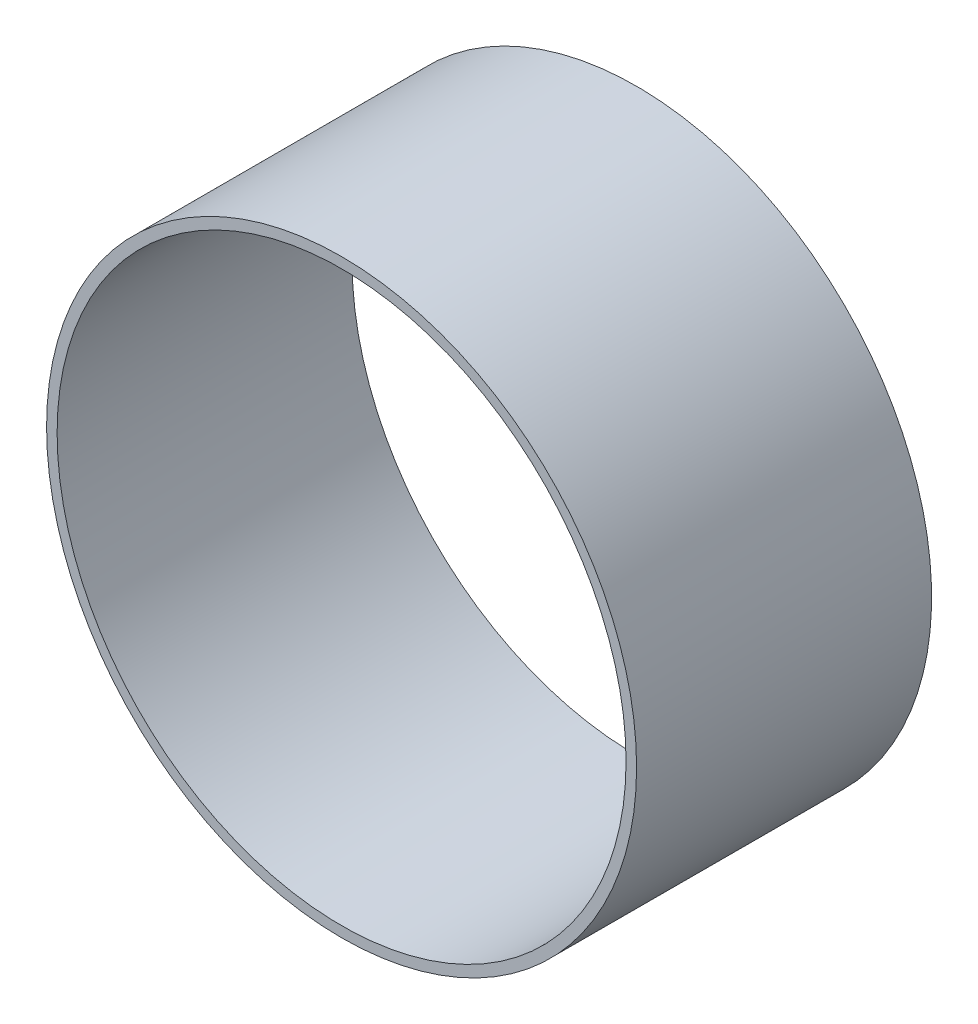
ISO-10303-21;
HEADER;
FILE_DESCRIPTION(('STEP AP214'),'2;1');
FILE_NAME('part.step','',(''),(''),'','','');
FILE_SCHEMA(('AUTOMOTIVE_DESIGN { 1 0 10303 214 1 1 1 1 }'));
ENDSEC;
DATA;
#1=APPLICATION_CONTEXT('core data for automotive mechanical design processes');
#2=APPLICATION_PROTOCOL_DEFINITION('international standard','automotive_design',2000,#1);
#3=PRODUCT_CONTEXT('',#1,'mechanical');
#4=PRODUCT('Part','Part','',(#3));
#5=PRODUCT_RELATED_PRODUCT_CATEGORY('part','',(#4));
#6=PRODUCT_DEFINITION_FORMATION('','',#4);
#7=PRODUCT_DEFINITION_CONTEXT('part definition',#1,'design');
#8=PRODUCT_DEFINITION('design','',#6,#7);
#9=PRODUCT_DEFINITION_SHAPE('','',#8);
#10=(LENGTH_UNIT() NAMED_UNIT(*) SI_UNIT(.MILLI.,.METRE.));
#11=(NAMED_UNIT(*) PLANE_ANGLE_UNIT() SI_UNIT($,.RADIAN.));
#12=(NAMED_UNIT(*) SI_UNIT($,.STERADIAN.) SOLID_ANGLE_UNIT());
#13=UNCERTAINTY_MEASURE_WITH_UNIT(LENGTH_MEASURE(1.E-05),#10,'distance_accuracy_value','');
#14=(GEOMETRIC_REPRESENTATION_CONTEXT(3) GLOBAL_UNCERTAINTY_ASSIGNED_CONTEXT((#13)) GLOBAL_UNIT_ASSIGNED_CONTEXT((#10,
#11,#12)) REPRESENTATION_CONTEXT('',''));
#15=CARTESIAN_POINT('',(0.,0.,0.));
#16=DIRECTION('',(0.,0.,1.));
#17=DIRECTION('',(1.,0.,0.));
#18=AXIS2_PLACEMENT_3D('',#15,#16,#17);
#19=CARTESIAN_POINT('',(0.,0.,19.));
#20=DIRECTION('',(0.,0.,-1.));
#21=DIRECTION('',(-1.,0.,0.));
#22=AXIS2_PLACEMENT_3D('',#19,#20,#21);
#23=CYLINDRICAL_SURFACE('',#22,14.);
#24=CARTESIAN_POINT('',(0.,0.,19.));
#25=DIRECTION('',(0.,0.,1.));
#26=DIRECTION('',(1.,0.,0.));
#27=AXIS2_PLACEMENT_3D('',#24,#25,#26);
#28=CIRCLE('',#27,14.);
#29=CARTESIAN_POINT('',(14.,0.,19.));
#30=VERTEX_POINT('',#29);
#31=EDGE_CURVE('E10',#30,#30,#28,.T.);
#32=ORIENTED_EDGE('',*,*,#31,.F.);
#33=EDGE_LOOP('',(#32));
#34=FACE_BOUND('',#33,.T.);
#35=CARTESIAN_POINT('',(0.,0.,5.));
#36=DIRECTION('',(0.,0.,-1.));
#37=DIRECTION('',(-1.,0.,0.));
#38=AXIS2_PLACEMENT_3D('',#35,#36,#37);
#39=CIRCLE('',#38,14.);
#40=CARTESIAN_POINT('',(-14.,0.,5.));
#41=VERTEX_POINT('',#40);
#42=EDGE_CURVE('E43',#41,#41,#39,.T.);
#43=ORIENTED_EDGE('',*,*,#42,.F.);
#44=EDGE_LOOP('',(#43));
#45=FACE_BOUND('',#44,.T.);
#46=ADVANCED_FACE('F32',(#34,#45),#23,.T.);
#47=CARTESIAN_POINT('',(0.,0.,19.));
#48=DIRECTION('',(0.,0.,-1.));
#49=DIRECTION('',(-1.,0.,0.));
#50=AXIS2_PLACEMENT_3D('',#47,#48,#49);
#51=CYLINDRICAL_SURFACE('',#50,13.5);
#52=CARTESIAN_POINT('',(0.,0.,19.));
#53=DIRECTION('',(0.,0.,1.));
#54=DIRECTION('',(1.,0.,0.));
#55=AXIS2_PLACEMENT_3D('',#52,#53,#54);
#56=CIRCLE('',#55,13.5);
#57=CARTESIAN_POINT('',(13.5,0.,19.));
#58=VERTEX_POINT('',#57);
#59=EDGE_CURVE('E39',#58,#58,#56,.T.);
#60=ORIENTED_EDGE('',*,*,#59,.T.);
#61=EDGE_LOOP('',(#60));
#62=FACE_BOUND('',#61,.T.);
#63=CARTESIAN_POINT('',(0.,0.,5.));
#64=DIRECTION('',(0.,0.,-1.));
#65=DIRECTION('',(-1.,0.,0.));
#66=AXIS2_PLACEMENT_3D('',#63,#64,#65);
#67=CIRCLE('',#66,13.5);
#68=CARTESIAN_POINT('',(-13.5,0.,5.));
#69=VERTEX_POINT('',#68);
#70=EDGE_CURVE('E35',#69,#69,#67,.T.);
#71=ORIENTED_EDGE('',*,*,#70,.T.);
#72=EDGE_LOOP('',(#71));
#73=FACE_BOUND('',#72,.T.);
#74=ADVANCED_FACE('F52',(#62,#73),#51,.F.);
#75=CARTESIAN_POINT('',(0.,0.,19.));
#76=DIRECTION('',(0.,0.,1.));
#77=DIRECTION('',(1.,0.,0.));
#78=AXIS2_PLACEMENT_3D('',#75,#76,#77);
#79=PLANE('',#78);
#80=ORIENTED_EDGE('',*,*,#31,.T.);
#81=EDGE_LOOP('',(#80));
#82=FACE_BOUND('',#81,.T.);
#83=ORIENTED_EDGE('',*,*,#59,.F.);
#84=EDGE_LOOP('',(#83));
#85=FACE_BOUND('',#84,.T.);
#86=ADVANCED_FACE('F56',(#82,#85),#79,.T.);
#87=CARTESIAN_POINT('',(0.,0.,5.));
#88=DIRECTION('',(0.,0.,-1.));
#89=DIRECTION('',(-1.,0.,0.));
#90=AXIS2_PLACEMENT_3D('',#87,#88,#89);
#91=PLANE('',#90);
#92=ORIENTED_EDGE('',*,*,#70,.F.);
#93=EDGE_LOOP('',(#92));
#94=FACE_BOUND('',#93,.T.);
#95=ORIENTED_EDGE('',*,*,#42,.T.);
#96=EDGE_LOOP('',(#95));
#97=FACE_BOUND('',#96,.T.);
#98=ADVANCED_FACE('F54',(#94,#97),#91,.T.);
#99=CLOSED_SHELL('',(#46,#74,#86,#98));
#100=MANIFOLD_SOLID_BREP('B2',#99);
#101=ADVANCED_BREP_SHAPE_REPRESENTATION('',(#18,#100),#14);
#102=SHAPE_DEFINITION_REPRESENTATION(#9,#101);
ENDSEC;
END-ISO-10303-21;
